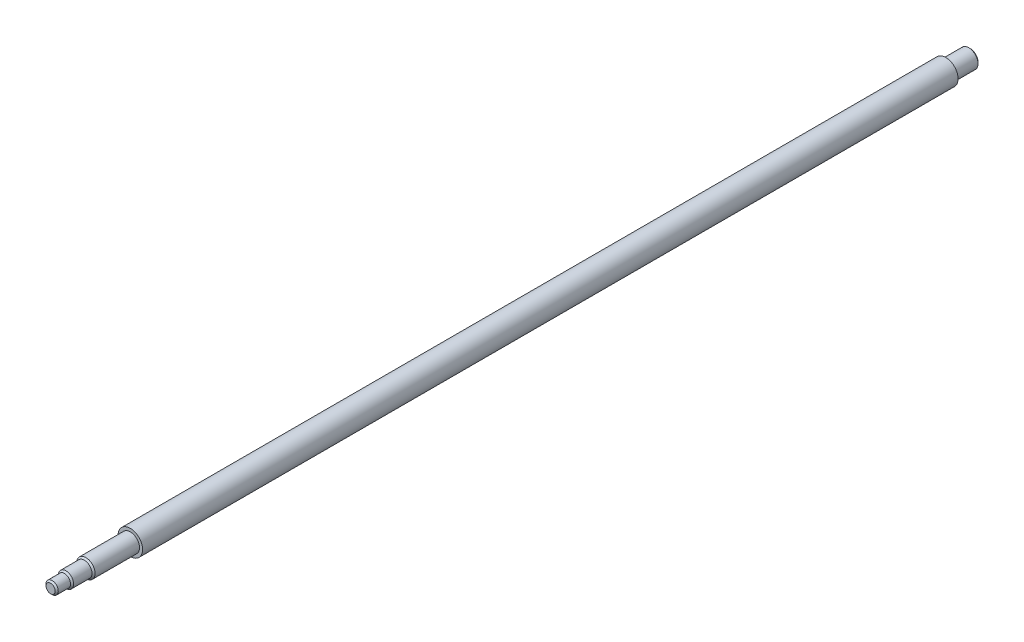
ISO-10303-21;
HEADER;
FILE_DESCRIPTION(('STEP AP214'),'2;1');
FILE_NAME('part.step','',(''),(''),'','','');
FILE_SCHEMA(('AUTOMOTIVE_DESIGN { 1 0 10303 214 1 1 1 1 }'));
ENDSEC;
DATA;
#1=APPLICATION_CONTEXT('core data for automotive mechanical design processes');
#2=APPLICATION_PROTOCOL_DEFINITION('international standard','automotive_design',2000,#1);
#3=PRODUCT_CONTEXT('',#1,'mechanical');
#4=PRODUCT('Part','Part','',(#3));
#5=PRODUCT_RELATED_PRODUCT_CATEGORY('part','',(#4));
#6=PRODUCT_DEFINITION_FORMATION('','',#4);
#7=PRODUCT_DEFINITION_CONTEXT('part definition',#1,'design');
#8=PRODUCT_DEFINITION('design','',#6,#7);
#9=PRODUCT_DEFINITION_SHAPE('','',#8);
#10=(LENGTH_UNIT() NAMED_UNIT(*) SI_UNIT(.MILLI.,.METRE.));
#11=(NAMED_UNIT(*) PLANE_ANGLE_UNIT() SI_UNIT($,.RADIAN.));
#12=(NAMED_UNIT(*) SI_UNIT($,.STERADIAN.) SOLID_ANGLE_UNIT());
#13=UNCERTAINTY_MEASURE_WITH_UNIT(LENGTH_MEASURE(1.E-05),#10,'distance_accuracy_value','');
#14=(GEOMETRIC_REPRESENTATION_CONTEXT(3) GLOBAL_UNCERTAINTY_ASSIGNED_CONTEXT((#13)) GLOBAL_UNIT_ASSIGNED_CONTEXT((#10,
#11,#12)) REPRESENTATION_CONTEXT('',''));
#15=CARTESIAN_POINT('',(0.,0.,0.));
#16=DIRECTION('',(0.,0.,1.));
#17=DIRECTION('',(1.,0.,0.));
#18=AXIS2_PLACEMENT_3D('',#15,#16,#17);
#19=CARTESIAN_POINT('',(0.,4.,0.));
#20=DIRECTION('',(0.,0.,-1.));
#21=DIRECTION('',(-1.,0.,0.));
#22=AXIS2_PLACEMENT_3D('',#19,#20,#21);
#23=PLANE('',#22);
#24=CARTESIAN_POINT('',(0.,0.,0.));
#25=DIRECTION('',(0.,0.,-1.));
#26=DIRECTION('',(-1.,0.,0.));
#27=AXIS2_PLACEMENT_3D('',#24,#25,#26);
#28=CIRCLE('',#27,2.99999999999984);
#29=CARTESIAN_POINT('',(-2.99999999999984,0.,0.));
#30=VERTEX_POINT('',#29);
#31=EDGE_CURVE('E54',#30,#30,#28,.F.);
#32=ORIENTED_EDGE('',*,*,#31,.T.);
#33=EDGE_LOOP('',(#32));
#34=FACE_BOUND('',#33,.T.);
#35=ADVANCED_FACE('F31',(#34),#23,.F.);
#36=CARTESIAN_POINT('',(0.,0.,-600.));
#37=DIRECTION('',(0.,0.,1.));
#38=DIRECTION('',(1.,0.,0.));
#39=AXIS2_PLACEMENT_3D('',#36,#37,#38);
#40=PLANE('',#39);
#41=CARTESIAN_POINT('',(0.,0.,-600.));
#42=DIRECTION('',(0.,0.,1.));
#43=DIRECTION('',(1.,0.,0.));
#44=AXIS2_PLACEMENT_3D('',#41,#42,#43);
#45=CIRCLE('',#44,5.00000000000023);
#46=CARTESIAN_POINT('',(5.00000000000023,0.,-600.));
#47=VERTEX_POINT('',#46);
#48=EDGE_CURVE('E10',#47,#47,#45,.F.);
#49=ORIENTED_EDGE('',*,*,#48,.T.);
#50=EDGE_LOOP('',(#49));
#51=FACE_BOUND('',#50,.T.);
#52=ADVANCED_FACE('F93',(#51),#40,.F.);
#53=CARTESIAN_POINT('',(0.,0.,0.));
#54=DIRECTION('',(0.,0.,1.));
#55=DIRECTION('',(1.,0.,0.));
#56=AXIS2_PLACEMENT_3D('',#53,#54,#55);
#57=CYLINDRICAL_SURFACE('',#56,6.);
#58=CARTESIAN_POINT('',(0.,0.,-599.));
#59=DIRECTION('',(0.,0.,1.));
#60=DIRECTION('',(1.,0.,0.));
#61=AXIS2_PLACEMENT_3D('',#58,#59,#60);
#62=CIRCLE('',#61,6.);
#63=CARTESIAN_POINT('',(6.,0.,-599.));
#64=VERTEX_POINT('',#63);
#65=EDGE_CURVE('E38',#64,#64,#62,.T.);
#66=ORIENTED_EDGE('',*,*,#65,.T.);
#67=EDGE_LOOP('',(#66));
#68=FACE_BOUND('',#67,.T.);
#69=CARTESIAN_POINT('',(0.,0.,-584.));
#70=DIRECTION('',(0.,0.,1.));
#71=DIRECTION('',(1.,0.,0.));
#72=AXIS2_PLACEMENT_3D('',#69,#70,#71);
#73=CIRCLE('',#72,6.);
#74=CARTESIAN_POINT('',(6.,0.,-584.));
#75=VERTEX_POINT('',#74);
#76=EDGE_CURVE('E57',#75,#75,#73,.T.);
#77=ORIENTED_EDGE('',*,*,#76,.F.);
#78=EDGE_LOOP('',(#77));
#79=FACE_BOUND('',#78,.T.);
#80=ADVANCED_FACE('F99',(#68,#79),#57,.T.);
#81=CARTESIAN_POINT('',(0.,6.,-584.));
#82=DIRECTION('',(0.,0.,1.));
#83=DIRECTION('',(1.,0.,0.));
#84=AXIS2_PLACEMENT_3D('',#81,#82,#83);
#85=PLANE('',#84);
#86=CARTESIAN_POINT('',(0.,0.,-584.));
#87=DIRECTION('',(0.,0.,1.));
#88=DIRECTION('',(1.,0.,0.));
#89=AXIS2_PLACEMENT_3D('',#86,#87,#88);
#90=CIRCLE('',#89,8.00000000000001);
#91=CARTESIAN_POINT('',(8.00000000000001,0.,-584.));
#92=VERTEX_POINT('',#91);
#93=EDGE_CURVE('E60',#92,#92,#90,.T.);
#94=ORIENTED_EDGE('',*,*,#93,.F.);
#95=EDGE_LOOP('',(#94));
#96=FACE_BOUND('',#95,.T.);
#97=ORIENTED_EDGE('',*,*,#76,.T.);
#98=EDGE_LOOP('',(#97));
#99=FACE_BOUND('',#98,.T.);
#100=ADVANCED_FACE('F104',(#96,#99),#85,.F.);
#101=CARTESIAN_POINT('',(0.,0.,0.));
#102=DIRECTION('',(0.,0.,1.));
#103=DIRECTION('',(1.,0.,0.));
#104=AXIS2_PLACEMENT_3D('',#101,#102,#103);
#105=CYLINDRICAL_SURFACE('',#104,7.99999999999998);
#106=CARTESIAN_POINT('',(0.,0.,-52.));
#107=DIRECTION('',(0.,0.,1.));
#108=DIRECTION('',(1.,0.,0.));
#109=AXIS2_PLACEMENT_3D('',#106,#107,#108);
#110=CIRCLE('',#109,7.99999999999995);
#111=CARTESIAN_POINT('',(7.99999999999995,0.,-52.));
#112=VERTEX_POINT('',#111);
#113=EDGE_CURVE('E63',#112,#112,#110,.T.);
#114=ORIENTED_EDGE('',*,*,#113,.F.);
#115=EDGE_LOOP('',(#114));
#116=FACE_BOUND('',#115,.T.);
#117=ORIENTED_EDGE('',*,*,#93,.T.);
#118=EDGE_LOOP('',(#117));
#119=FACE_BOUND('',#118,.T.);
#120=ADVANCED_FACE('F107',(#116,#119),#105,.T.);
#121=CARTESIAN_POINT('',(0.,7.99999999999995,-52.));
#122=DIRECTION('',(0.,0.,-1.));
#123=DIRECTION('',(-1.,0.,0.));
#124=AXIS2_PLACEMENT_3D('',#121,#122,#123);
#125=PLANE('',#124);
#126=CARTESIAN_POINT('',(0.,0.,-52.));
#127=DIRECTION('',(0.,0.,1.));
#128=DIRECTION('',(1.,0.,0.));
#129=AXIS2_PLACEMENT_3D('',#126,#127,#128);
#130=CIRCLE('',#129,6.);
#131=CARTESIAN_POINT('',(6.,0.,-52.));
#132=VERTEX_POINT('',#131);
#133=EDGE_CURVE('E66',#132,#132,#130,.T.);
#134=ORIENTED_EDGE('',*,*,#133,.F.);
#135=EDGE_LOOP('',(#134));
#136=FACE_BOUND('',#135,.T.);
#137=ORIENTED_EDGE('',*,*,#113,.T.);
#138=EDGE_LOOP('',(#137));
#139=FACE_BOUND('',#138,.T.);
#140=ADVANCED_FACE('F111',(#136,#139),#125,.F.);
#141=CARTESIAN_POINT('',(0.,0.,0.));
#142=DIRECTION('',(0.,0.,1.));
#143=DIRECTION('',(1.,0.,0.));
#144=AXIS2_PLACEMENT_3D('',#141,#142,#143);
#145=CYLINDRICAL_SURFACE('',#144,6.);
#146=CARTESIAN_POINT('',(0.,0.,-23.0000000000001));
#147=DIRECTION('',(0.,0.,-1.));
#148=DIRECTION('',(-1.,0.,0.));
#149=AXIS2_PLACEMENT_3D('',#146,#147,#148);
#150=CIRCLE('',#149,6.);
#151=CARTESIAN_POINT('',(-6.,0.,-23.0000000000001));
#152=VERTEX_POINT('',#151);
#153=EDGE_CURVE('E42',#152,#152,#150,.T.);
#154=ORIENTED_EDGE('',*,*,#153,.T.);
#155=EDGE_LOOP('',(#154));
#156=FACE_BOUND('',#155,.T.);
#157=ORIENTED_EDGE('',*,*,#133,.T.);
#158=EDGE_LOOP('',(#157));
#159=FACE_BOUND('',#158,.T.);
#160=ADVANCED_FACE('F115',(#156,#159),#145,.T.);
#161=CARTESIAN_POINT('',(0.,0.,0.));
#162=DIRECTION('',(0.,0.,1.));
#163=DIRECTION('',(1.,0.,0.));
#164=AXIS2_PLACEMENT_3D('',#161,#162,#163);
#165=CYLINDRICAL_SURFACE('',#164,5.);
#166=CARTESIAN_POINT('',(0.,0.,-10.0000000000001));
#167=DIRECTION('',(0.,0.,-1.));
#168=DIRECTION('',(-1.,0.,0.));
#169=AXIS2_PLACEMENT_3D('',#166,#167,#168);
#170=CIRCLE('',#169,5.);
#171=CARTESIAN_POINT('',(-5.,0.,-10.0000000000001));
#172=VERTEX_POINT('',#171);
#173=EDGE_CURVE('E46',#172,#172,#170,.T.);
#174=ORIENTED_EDGE('',*,*,#173,.T.);
#175=EDGE_LOOP('',(#174));
#176=FACE_BOUND('',#175,.T.);
#177=CARTESIAN_POINT('',(0.,0.,-22.));
#178=DIRECTION('',(0.,0.,1.));
#179=DIRECTION('',(1.,0.,0.));
#180=AXIS2_PLACEMENT_3D('',#177,#178,#179);
#181=CIRCLE('',#180,5.);
#182=CARTESIAN_POINT('',(5.,0.,-22.));
#183=VERTEX_POINT('',#182);
#184=EDGE_CURVE('E69',#183,#183,#181,.T.);
#185=ORIENTED_EDGE('',*,*,#184,.T.);
#186=EDGE_LOOP('',(#185));
#187=FACE_BOUND('',#186,.T.);
#188=ADVANCED_FACE('F119',(#176,#187),#165,.T.);
#189=CARTESIAN_POINT('',(0.,0.,0.));
#190=DIRECTION('',(0.,0.,1.));
#191=DIRECTION('',(1.,0.,0.));
#192=AXIS2_PLACEMENT_3D('',#189,#190,#191);
#193=CYLINDRICAL_SURFACE('',#192,4.);
#194=CARTESIAN_POINT('',(0.,0.,-1.00000000000012));
#195=DIRECTION('',(0.,0.,-1.));
#196=DIRECTION('',(-1.,0.,0.));
#197=AXIS2_PLACEMENT_3D('',#194,#195,#196);
#198=CIRCLE('',#197,4.);
#199=CARTESIAN_POINT('',(-4.,0.,-1.00000000000012));
#200=VERTEX_POINT('',#199);
#201=EDGE_CURVE('E51',#200,#200,#198,.T.);
#202=ORIENTED_EDGE('',*,*,#201,.T.);
#203=EDGE_LOOP('',(#202));
#204=FACE_BOUND('',#203,.T.);
#205=CARTESIAN_POINT('',(0.,0.,-9.));
#206=DIRECTION('',(0.,0.,1.));
#207=DIRECTION('',(1.,0.,0.));
#208=AXIS2_PLACEMENT_3D('',#205,#206,#207);
#209=CIRCLE('',#208,4.);
#210=CARTESIAN_POINT('',(4.,0.,-9.));
#211=VERTEX_POINT('',#210);
#212=EDGE_CURVE('E72',#211,#211,#209,.T.);
#213=ORIENTED_EDGE('',*,*,#212,.T.);
#214=EDGE_LOOP('',(#213));
#215=FACE_BOUND('',#214,.T.);
#216=ADVANCED_FACE('F76',(#204,#215),#193,.T.);
#217=CARTESIAN_POINT('',(0.,0.,0.));
#218=DIRECTION('',(0.,0.,-1.));
#219=DIRECTION('',(-1.,0.,0.));
#220=AXIS2_PLACEMENT_3D('',#217,#218,#219);
#221=CONICAL_SURFACE('',#220,2.99999999999984,0.785398163397469);
#222=ORIENTED_EDGE('',*,*,#201,.F.);
#223=EDGE_LOOP('',(#222));
#224=FACE_BOUND('',#223,.T.);
#225=ORIENTED_EDGE('',*,*,#31,.F.);
#226=EDGE_LOOP('',(#225));
#227=FACE_BOUND('',#226,.T.);
#228=ADVANCED_FACE('F81',(#224,#227),#221,.T.);
#229=CARTESIAN_POINT('',(0.,0.,-9.));
#230=DIRECTION('',(0.,0.,-1.));
#231=DIRECTION('',(-1.,0.,0.));
#232=AXIS2_PLACEMENT_3D('',#229,#230,#231);
#233=CONICAL_SURFACE('',#232,3.99999999999989,0.785398163397467);
#234=ORIENTED_EDGE('',*,*,#173,.F.);
#235=EDGE_LOOP('',(#234));
#236=FACE_BOUND('',#235,.T.);
#237=ORIENTED_EDGE('',*,*,#212,.F.);
#238=EDGE_LOOP('',(#237));
#239=FACE_BOUND('',#238,.T.);
#240=ADVANCED_FACE('F78',(#236,#239),#233,.T.);
#241=CARTESIAN_POINT('',(0.,0.,-22.));
#242=DIRECTION('',(0.,0.,-1.));
#243=DIRECTION('',(-1.,0.,0.));
#244=AXIS2_PLACEMENT_3D('',#241,#242,#243);
#245=CONICAL_SURFACE('',#244,4.99999999999984,0.785398163397466);
#246=ORIENTED_EDGE('',*,*,#153,.F.);
#247=EDGE_LOOP('',(#246));
#248=FACE_BOUND('',#247,.T.);
#249=ORIENTED_EDGE('',*,*,#184,.F.);
#250=EDGE_LOOP('',(#249));
#251=FACE_BOUND('',#250,.T.);
#252=ADVANCED_FACE('F80',(#248,#251),#245,.T.);
#253=CARTESIAN_POINT('',(0.,0.,-599.));
#254=DIRECTION('',(0.,0.,1.));
#255=DIRECTION('',(1.,0.,0.));
#256=AXIS2_PLACEMENT_3D('',#253,#254,#255);
#257=CONICAL_SURFACE('',#256,6.,0.785398163397445);
#258=ORIENTED_EDGE('',*,*,#48,.F.);
#259=EDGE_LOOP('',(#258));
#260=FACE_BOUND('',#259,.T.);
#261=ORIENTED_EDGE('',*,*,#65,.F.);
#262=EDGE_LOOP('',(#261));
#263=FACE_BOUND('',#262,.T.);
#264=ADVANCED_FACE('F33',(#260,#263),#257,.T.);
#265=CLOSED_SHELL('',(#35,#52,#80,#100,#120,#140,#160,#188,#216,#228,#240,#252,#264));
#266=MANIFOLD_SOLID_BREP('B2',#265);
#267=ADVANCED_BREP_SHAPE_REPRESENTATION('',(#18,#266),#14);
#268=SHAPE_DEFINITION_REPRESENTATION(#9,#267);
ENDSEC;
END-ISO-10303-21;
